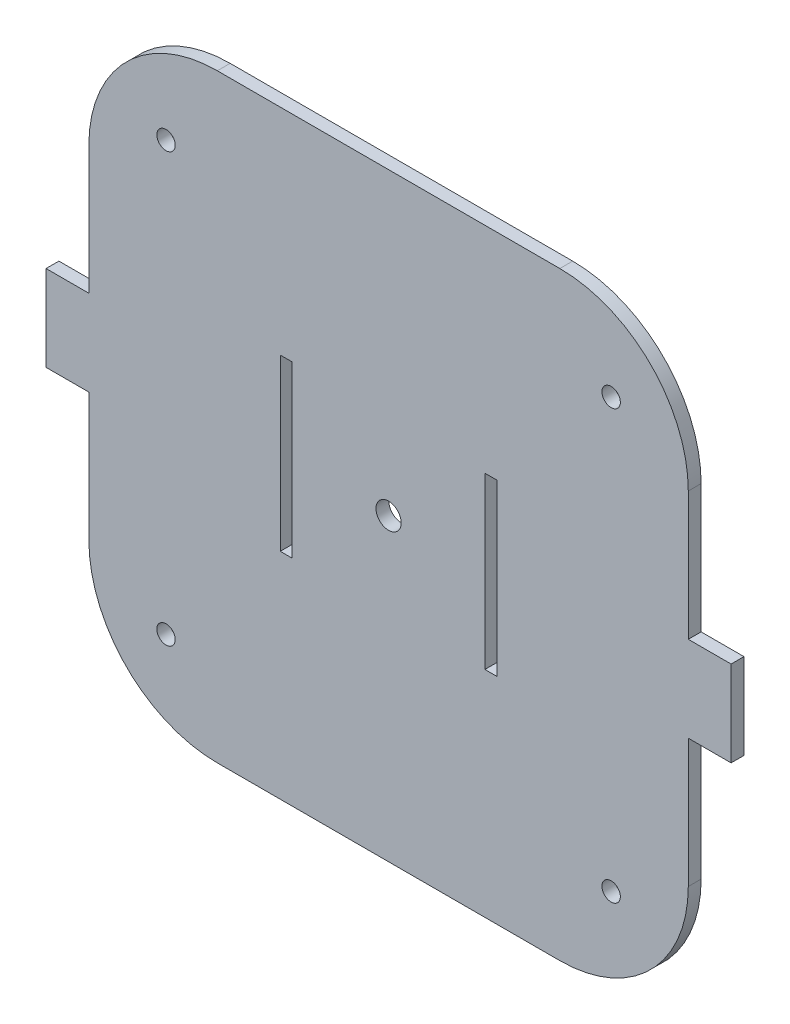
ISO-10303-21;
HEADER;
FILE_DESCRIPTION(('STEP AP214'),'2;1');
FILE_NAME('part.step','',(''),(''),'','','');
FILE_SCHEMA(('AUTOMOTIVE_DESIGN { 1 0 10303 214 1 1 1 1 }'));
ENDSEC;
DATA;
#1=APPLICATION_CONTEXT('core data for automotive mechanical design processes');
#2=APPLICATION_PROTOCOL_DEFINITION('international standard','automotive_design',2000,#1);
#3=PRODUCT_CONTEXT('',#1,'mechanical');
#4=PRODUCT('Part','Part','',(#3));
#5=PRODUCT_RELATED_PRODUCT_CATEGORY('part','',(#4));
#6=PRODUCT_DEFINITION_FORMATION('','',#4);
#7=PRODUCT_DEFINITION_CONTEXT('part definition',#1,'design');
#8=PRODUCT_DEFINITION('design','',#6,#7);
#9=PRODUCT_DEFINITION_SHAPE('','',#8);
#10=(LENGTH_UNIT() NAMED_UNIT(*) SI_UNIT(.MILLI.,.METRE.));
#11=(NAMED_UNIT(*) PLANE_ANGLE_UNIT() SI_UNIT($,.RADIAN.));
#12=(NAMED_UNIT(*) SI_UNIT($,.STERADIAN.) SOLID_ANGLE_UNIT());
#13=UNCERTAINTY_MEASURE_WITH_UNIT(LENGTH_MEASURE(1.E-05),#10,'distance_accuracy_value','');
#14=(GEOMETRIC_REPRESENTATION_CONTEXT(3) GLOBAL_UNCERTAINTY_ASSIGNED_CONTEXT((#13)) GLOBAL_UNIT_ASSIGNED_CONTEXT((#10,
#11,#12)) REPRESENTATION_CONTEXT('',''));
#15=CARTESIAN_POINT('',(0.,0.,0.));
#16=DIRECTION('',(0.,0.,1.));
#17=DIRECTION('',(1.,0.,0.));
#18=AXIS2_PLACEMENT_3D('',#15,#16,#17);
#19=CARTESIAN_POINT('',(30.,0.,3.));
#20=DIRECTION('',(0.,0.,1.));
#21=DIRECTION('',(1.,0.,0.));
#22=AXIS2_PLACEMENT_3D('',#19,#20,#21);
#23=PLANE('',#22);
#24=CARTESIAN_POINT('',(121.983290325234,-9.99999999999999,3.));
#25=DIRECTION('',(0.,0.,1.));
#26=DIRECTION('',(-1.,0.,0.));
#27=AXIS2_PLACEMENT_3D('',#24,#25,#26);
#28=CIRCLE('',#27,2.15);
#29=CARTESIAN_POINT('',(119.833290325234,-9.99999999999999,3.));
#30=VERTEX_POINT('',#29);
#31=EDGE_CURVE('E903',#30,#30,#28,.T.);
#32=ORIENTED_EDGE('',*,*,#31,.F.);
#33=EDGE_LOOP('',(#32));
#34=FACE_BOUND('',#33,.T.);
#35=CARTESIAN_POINT('',(18.0167096747658,-9.99999999999999,3.));
#36=DIRECTION('',(0.,0.,1.));
#37=DIRECTION('',(1.,0.,0.));
#38=AXIS2_PLACEMENT_3D('',#35,#36,#37);
#39=CIRCLE('',#38,2.15);
#40=CARTESIAN_POINT('',(20.1667096747658,-9.99999999999999,3.));
#41=VERTEX_POINT('',#40);
#42=EDGE_CURVE('E240',#41,#41,#39,.T.);
#43=ORIENTED_EDGE('',*,*,#42,.F.);
#44=EDGE_LOOP('',(#43));
#45=FACE_BOUND('',#44,.T.);
#46=CARTESIAN_POINT('',(30.,0.,3.));
#47=DIRECTION('',(0.,0.,1.));
#48=DIRECTION('',(1.,0.,0.));
#49=AXIS2_PLACEMENT_3D('',#46,#47,#48);
#50=CIRCLE('',#49,30.);
#51=CARTESIAN_POINT('',(0.,0.,3.));
#52=VERTEX_POINT('',#51);
#53=CARTESIAN_POINT('',(30.,-30.,3.));
#54=VERTEX_POINT('',#53);
#55=EDGE_CURVE('E308',#52,#54,#50,.T.);
#56=ORIENTED_EDGE('',*,*,#55,.T.);
#57=DIRECTION('',(1.,0.,0.));
#58=VECTOR('',#57,1.);
#59=CARTESIAN_POINT('',(30.,-30.,3.));
#60=LINE('',#59,#58);
#61=CARTESIAN_POINT('',(110.,-30.,3.));
#62=VERTEX_POINT('',#61);
#63=EDGE_CURVE('E312',#54,#62,#60,.T.);
#64=ORIENTED_EDGE('',*,*,#63,.T.);
#65=CARTESIAN_POINT('',(110.,0.,3.));
#66=DIRECTION('',(0.,0.,1.));
#67=DIRECTION('',(1.,0.,0.));
#68=AXIS2_PLACEMENT_3D('',#65,#66,#67);
#69=CIRCLE('',#68,30.);
#70=CARTESIAN_POINT('',(140.,0.,3.));
#71=VERTEX_POINT('',#70);
#72=EDGE_CURVE('E316',#62,#71,#69,.T.);
#73=ORIENTED_EDGE('',*,*,#72,.T.);
#74=DIRECTION('',(0.,1.,0.));
#75=VECTOR('',#74,1.);
#76=CARTESIAN_POINT('',(140.,30.,3.));
#77=LINE('',#76,#75);
#78=CARTESIAN_POINT('',(140.,30.,3.));
#79=VERTEX_POINT('',#78);
#80=EDGE_CURVE('E319',#71,#79,#77,.T.);
#81=ORIENTED_EDGE('',*,*,#80,.T.);
#82=DIRECTION('',(1.,0.,0.));
#83=VECTOR('',#82,1.);
#84=CARTESIAN_POINT('',(140.,30.,3.));
#85=LINE('',#84,#83);
#86=CARTESIAN_POINT('',(150.,30.,3.));
#87=VERTEX_POINT('',#86);
#88=EDGE_CURVE('E322',#79,#87,#85,.T.);
#89=ORIENTED_EDGE('',*,*,#88,.T.);
#90=DIRECTION('',(0.,1.,0.));
#91=VECTOR('',#90,1.);
#92=CARTESIAN_POINT('',(150.,40.,3.));
#93=LINE('',#92,#91);
#94=CARTESIAN_POINT('',(150.,50.,3.));
#95=VERTEX_POINT('',#94);
#96=EDGE_CURVE('E325',#87,#95,#93,.T.);
#97=ORIENTED_EDGE('',*,*,#96,.T.);
#98=DIRECTION('',(-1.,0.,0.));
#99=VECTOR('',#98,1.);
#100=CARTESIAN_POINT('',(140.,50.,3.));
#101=LINE('',#100,#99);
#102=CARTESIAN_POINT('',(140.,50.,3.));
#103=VERTEX_POINT('',#102);
#104=EDGE_CURVE('E328',#95,#103,#101,.T.);
#105=ORIENTED_EDGE('',*,*,#104,.T.);
#106=DIRECTION('',(0.,1.,0.));
#107=VECTOR('',#106,1.);
#108=CARTESIAN_POINT('',(140.,80.,3.));
#109=LINE('',#108,#107);
#110=CARTESIAN_POINT('',(140.,80.,3.));
#111=VERTEX_POINT('',#110);
#112=EDGE_CURVE('E331',#103,#111,#109,.T.);
#113=ORIENTED_EDGE('',*,*,#112,.T.);
#114=CARTESIAN_POINT('',(110.,80.,3.));
#115=DIRECTION('',(0.,0.,1.));
#116=DIRECTION('',(-1.,0.,0.));
#117=AXIS2_PLACEMENT_3D('',#114,#115,#116);
#118=CIRCLE('',#117,30.);
#119=CARTESIAN_POINT('',(110.,110.,3.));
#120=VERTEX_POINT('',#119);
#121=EDGE_CURVE('E334',#111,#120,#118,.T.);
#122=ORIENTED_EDGE('',*,*,#121,.T.);
#123=DIRECTION('',(-1.,0.,0.));
#124=VECTOR('',#123,1.);
#125=CARTESIAN_POINT('',(30.,110.,3.));
#126=LINE('',#125,#124);
#127=CARTESIAN_POINT('',(30.,110.,3.));
#128=VERTEX_POINT('',#127);
#129=EDGE_CURVE('E337',#120,#128,#126,.T.);
#130=ORIENTED_EDGE('',*,*,#129,.T.);
#131=CARTESIAN_POINT('',(30.,80.,3.));
#132=DIRECTION('',(0.,0.,1.));
#133=DIRECTION('',(-1.,0.,0.));
#134=AXIS2_PLACEMENT_3D('',#131,#132,#133);
#135=CIRCLE('',#134,30.);
#136=CARTESIAN_POINT('',(0.,80.,3.));
#137=VERTEX_POINT('',#136);
#138=EDGE_CURVE('E340',#128,#137,#135,.T.);
#139=ORIENTED_EDGE('',*,*,#138,.T.);
#140=DIRECTION('',(0.,-1.,0.));
#141=VECTOR('',#140,1.);
#142=CARTESIAN_POINT('',(0.,80.,3.));
#143=LINE('',#142,#141);
#144=CARTESIAN_POINT('',(0.,50.,3.));
#145=VERTEX_POINT('',#144);
#146=EDGE_CURVE('E343',#137,#145,#143,.T.);
#147=ORIENTED_EDGE('',*,*,#146,.T.);
#148=DIRECTION('',(-1.,0.,0.));
#149=VECTOR('',#148,1.);
#150=CARTESIAN_POINT('',(0.,50.,3.));
#151=LINE('',#150,#149);
#152=CARTESIAN_POINT('',(-10.,50.,3.));
#153=VERTEX_POINT('',#152);
#154=EDGE_CURVE('E346',#145,#153,#151,.T.);
#155=ORIENTED_EDGE('',*,*,#154,.T.);
#156=DIRECTION('',(0.,-1.,0.));
#157=VECTOR('',#156,1.);
#158=CARTESIAN_POINT('',(-10.,50.,3.));
#159=LINE('',#158,#157);
#160=CARTESIAN_POINT('',(-10.,30.,3.));
#161=VERTEX_POINT('',#160);
#162=EDGE_CURVE('E349',#153,#161,#159,.T.);
#163=ORIENTED_EDGE('',*,*,#162,.T.);
#164=DIRECTION('',(1.,0.,0.));
#165=VECTOR('',#164,1.);
#166=CARTESIAN_POINT('',(0.,30.,3.));
#167=LINE('',#166,#165);
#168=CARTESIAN_POINT('',(0.,30.,3.));
#169=VERTEX_POINT('',#168);
#170=EDGE_CURVE('E352',#161,#169,#167,.T.);
#171=ORIENTED_EDGE('',*,*,#170,.T.);
#172=DIRECTION('',(0.,-1.,0.));
#173=VECTOR('',#172,1.);
#174=CARTESIAN_POINT('',(0.,30.,3.));
#175=LINE('',#174,#173);
#176=EDGE_CURVE('E355',#169,#52,#175,.T.);
#177=ORIENTED_EDGE('',*,*,#176,.T.);
#178=EDGE_LOOP('',(#56,#64,#73,#81,#89,#97,#105,#113,#122,#130,#139,#147,#155,#163,#171,#177));
#179=FACE_BOUND('',#178,.T.);
#180=CARTESIAN_POINT('',(70.,40.,3.));
#181=DIRECTION('',(0.,0.,1.));
#182=DIRECTION('',(1.,0.,0.));
#183=AXIS2_PLACEMENT_3D('',#180,#181,#182);
#184=CIRCLE('',#183,2.95);
#185=CARTESIAN_POINT('',(72.95,40.,3.));
#186=VERTEX_POINT('',#185);
#187=EDGE_CURVE('E300',#186,#186,#184,.T.);
#188=ORIENTED_EDGE('',*,*,#187,.F.);
#189=EDGE_LOOP('',(#188));
#190=FACE_BOUND('',#189,.T.);
#191=DIRECTION('',(1.,0.,0.));
#192=VECTOR('',#191,1.);
#193=CARTESIAN_POINT('',(47.5,20.15,3.));
#194=LINE('',#193,#192);
#195=CARTESIAN_POINT('',(44.7,20.15,3.));
#196=VERTEX_POINT('',#195);
#197=CARTESIAN_POINT('',(47.5,20.15,3.));
#198=VERTEX_POINT('',#197);
#199=EDGE_CURVE('E259',#196,#198,#194,.T.);
#200=ORIENTED_EDGE('',*,*,#199,.F.);
#201=DIRECTION('',(0.,-1.,0.));
#202=VECTOR('',#201,1.);
#203=CARTESIAN_POINT('',(44.7,20.15,3.));
#204=LINE('',#203,#202);
#205=CARTESIAN_POINT('',(44.7,59.85,3.));
#206=VERTEX_POINT('',#205);
#207=EDGE_CURVE('E256',#206,#196,#204,.T.);
#208=ORIENTED_EDGE('',*,*,#207,.F.);
#209=DIRECTION('',(-1.,0.,0.));
#210=VECTOR('',#209,1.);
#211=CARTESIAN_POINT('',(44.7,59.85,3.));
#212=LINE('',#211,#210);
#213=CARTESIAN_POINT('',(47.5,59.85,3.));
#214=VERTEX_POINT('',#213);
#215=EDGE_CURVE('E267',#214,#206,#212,.T.);
#216=ORIENTED_EDGE('',*,*,#215,.F.);
#217=DIRECTION('',(0.,1.,0.));
#218=VECTOR('',#217,1.);
#219=CARTESIAN_POINT('',(47.5,40.,3.));
#220=LINE('',#219,#218);
#221=EDGE_CURVE('E263',#198,#214,#220,.T.);
#222=ORIENTED_EDGE('',*,*,#221,.F.);
#223=EDGE_LOOP('',(#200,#208,#216,#222));
#224=FACE_BOUND('',#223,.T.);
#225=DIRECTION('',(0.,-1.,0.));
#226=VECTOR('',#225,1.);
#227=CARTESIAN_POINT('',(92.5,59.85,3.));
#228=LINE('',#227,#226);
#229=CARTESIAN_POINT('',(92.5,59.85,3.));
#230=VERTEX_POINT('',#229);
#231=CARTESIAN_POINT('',(92.5,20.15,3.));
#232=VERTEX_POINT('',#231);
#233=EDGE_CURVE('E214',#230,#232,#228,.T.);
#234=ORIENTED_EDGE('',*,*,#233,.F.);
#235=DIRECTION('',(-1.,0.,0.));
#236=VECTOR('',#235,1.);
#237=CARTESIAN_POINT('',(95.3,59.85,3.));
#238=LINE('',#237,#236);
#239=CARTESIAN_POINT('',(95.3,59.85,3.));
#240=VERTEX_POINT('',#239);
#241=EDGE_CURVE('E205',#240,#230,#238,.T.);
#242=ORIENTED_EDGE('',*,*,#241,.F.);
#243=DIRECTION('',(0.,1.,0.));
#244=VECTOR('',#243,1.);
#245=CARTESIAN_POINT('',(95.3,20.15,3.));
#246=LINE('',#245,#244);
#247=CARTESIAN_POINT('',(95.3,20.15,3.));
#248=VERTEX_POINT('',#247);
#249=EDGE_CURVE('E232',#248,#240,#246,.T.);
#250=ORIENTED_EDGE('',*,*,#249,.F.);
#251=DIRECTION('',(1.,0.,0.));
#252=VECTOR('',#251,1.);
#253=CARTESIAN_POINT('',(92.5,20.15,3.));
#254=LINE('',#253,#252);
#255=EDGE_CURVE('E228',#232,#248,#254,.T.);
#256=ORIENTED_EDGE('',*,*,#255,.F.);
#257=EDGE_LOOP('',(#234,#242,#250,#256));
#258=FACE_BOUND('',#257,.T.);
#259=CARTESIAN_POINT('',(18.0167096747658,90.,3.));
#260=DIRECTION('',(0.,0.,1.));
#261=DIRECTION('',(-1.,0.,0.));
#262=AXIS2_PLACEMENT_3D('',#259,#260,#261);
#263=CIRCLE('',#262,2.15);
#264=CARTESIAN_POINT('',(15.8667096747658,90.,3.));
#265=VERTEX_POINT('',#264);
#266=EDGE_CURVE('E911',#265,#265,#263,.T.);
#267=ORIENTED_EDGE('',*,*,#266,.F.);
#268=EDGE_LOOP('',(#267));
#269=FACE_BOUND('',#268,.T.);
#270=CARTESIAN_POINT('',(121.983290325234,90.0000000000001,3.));
#271=DIRECTION('',(0.,0.,1.));
#272=DIRECTION('',(1.,0.,0.));
#273=AXIS2_PLACEMENT_3D('',#270,#271,#272);
#274=CIRCLE('',#273,2.15);
#275=CARTESIAN_POINT('',(124.133290325234,90.0000000000001,3.));
#276=VERTEX_POINT('',#275);
#277=EDGE_CURVE('E892',#276,#276,#274,.T.);
#278=ORIENTED_EDGE('',*,*,#277,.F.);
#279=EDGE_LOOP('',(#278));
#280=FACE_BOUND('',#279,.T.);
#281=ADVANCED_FACE('F43',(#34,#45,#179,#190,#224,#258,#269,#280),#23,.T.);
#282=CARTESIAN_POINT('',(30.,0.,0.));
#283=DIRECTION('',(0.,0.,1.));
#284=DIRECTION('',(1.,0.,0.));
#285=AXIS2_PLACEMENT_3D('',#282,#283,#284);
#286=PLANE('',#285);
#287=DIRECTION('',(0.,-1.,0.));
#288=VECTOR('',#287,1.);
#289=CARTESIAN_POINT('',(44.7,20.15,0.));
#290=LINE('',#289,#288);
#291=CARTESIAN_POINT('',(44.7,59.85,0.));
#292=VERTEX_POINT('',#291);
#293=CARTESIAN_POINT('',(44.7,20.15,0.));
#294=VERTEX_POINT('',#293);
#295=EDGE_CURVE('E223',#292,#294,#290,.T.);
#296=ORIENTED_EDGE('',*,*,#295,.T.);
#297=DIRECTION('',(1.,0.,0.));
#298=VECTOR('',#297,1.);
#299=CARTESIAN_POINT('',(47.5,20.15,0.));
#300=LINE('',#299,#298);
#301=CARTESIAN_POINT('',(47.5,20.15,0.));
#302=VERTEX_POINT('',#301);
#303=EDGE_CURVE('E274',#294,#302,#300,.T.);
#304=ORIENTED_EDGE('',*,*,#303,.T.);
#305=DIRECTION('',(0.,1.,0.));
#306=VECTOR('',#305,1.);
#307=CARTESIAN_POINT('',(47.5,59.85,0.));
#308=LINE('',#307,#306);
#309=CARTESIAN_POINT('',(47.5,59.85,0.));
#310=VERTEX_POINT('',#309);
#311=EDGE_CURVE('E278',#302,#310,#308,.T.);
#312=ORIENTED_EDGE('',*,*,#311,.T.);
#313=DIRECTION('',(-1.,0.,0.));
#314=VECTOR('',#313,1.);
#315=CARTESIAN_POINT('',(44.7,59.85,0.));
#316=LINE('',#315,#314);
#317=EDGE_CURVE('E260',#310,#292,#316,.T.);
#318=ORIENTED_EDGE('',*,*,#317,.T.);
#319=EDGE_LOOP('',(#296,#304,#312,#318));
#320=FACE_BOUND('',#319,.T.);
#321=CARTESIAN_POINT('',(30.,0.,0.));
#322=DIRECTION('',(0.,0.,1.));
#323=DIRECTION('',(1.,0.,0.));
#324=AXIS2_PLACEMENT_3D('',#321,#322,#323);
#325=CIRCLE('',#324,30.);
#326=CARTESIAN_POINT('',(0.,0.,0.));
#327=VERTEX_POINT('',#326);
#328=CARTESIAN_POINT('',(30.,-30.,0.));
#329=VERTEX_POINT('',#328);
#330=EDGE_CURVE('E304',#327,#329,#325,.T.);
#331=ORIENTED_EDGE('',*,*,#330,.F.);
#332=DIRECTION('',(0.,-1.,0.));
#333=VECTOR('',#332,1.);
#334=CARTESIAN_POINT('',(0.,30.,0.));
#335=LINE('',#334,#333);
#336=CARTESIAN_POINT('',(0.,30.,0.));
#337=VERTEX_POINT('',#336);
#338=EDGE_CURVE('E313',#337,#327,#335,.T.);
#339=ORIENTED_EDGE('',*,*,#338,.F.);
#340=DIRECTION('',(1.,0.,0.));
#341=VECTOR('',#340,1.);
#342=CARTESIAN_POINT('',(0.,30.,0.));
#343=LINE('',#342,#341);
#344=CARTESIAN_POINT('',(-10.,30.,0.));
#345=VERTEX_POINT('',#344);
#346=EDGE_CURVE('E403',#345,#337,#343,.T.);
#347=ORIENTED_EDGE('',*,*,#346,.F.);
#348=DIRECTION('',(0.,-1.,0.));
#349=VECTOR('',#348,1.);
#350=CARTESIAN_POINT('',(-10.,40.,0.));
#351=LINE('',#350,#349);
#352=CARTESIAN_POINT('',(-10.,50.,0.));
#353=VERTEX_POINT('',#352);
#354=EDGE_CURVE('E400',#353,#345,#351,.T.);
#355=ORIENTED_EDGE('',*,*,#354,.F.);
#356=DIRECTION('',(-1.,0.,0.));
#357=VECTOR('',#356,1.);
#358=CARTESIAN_POINT('',(0.,50.,0.));
#359=LINE('',#358,#357);
#360=CARTESIAN_POINT('',(0.,50.,0.));
#361=VERTEX_POINT('',#360);
#362=EDGE_CURVE('E396',#361,#353,#359,.T.);
#363=ORIENTED_EDGE('',*,*,#362,.F.);
#364=DIRECTION('',(0.,-1.,0.));
#365=VECTOR('',#364,1.);
#366=CARTESIAN_POINT('',(0.,80.,0.));
#367=LINE('',#366,#365);
#368=CARTESIAN_POINT('',(0.,80.,0.));
#369=VERTEX_POINT('',#368);
#370=EDGE_CURVE('E393',#369,#361,#367,.T.);
#371=ORIENTED_EDGE('',*,*,#370,.F.);
#372=CARTESIAN_POINT('',(30.,80.,0.));
#373=DIRECTION('',(0.,0.,1.));
#374=DIRECTION('',(-1.,0.,0.));
#375=AXIS2_PLACEMENT_3D('',#372,#373,#374);
#376=CIRCLE('',#375,30.);
#377=CARTESIAN_POINT('',(30.,110.,0.));
#378=VERTEX_POINT('',#377);
#379=EDGE_CURVE('E390',#378,#369,#376,.T.);
#380=ORIENTED_EDGE('',*,*,#379,.F.);
#381=DIRECTION('',(-1.,0.,0.));
#382=VECTOR('',#381,1.);
#383=CARTESIAN_POINT('',(30.,110.,0.));
#384=LINE('',#383,#382);
#385=CARTESIAN_POINT('',(110.,110.,0.));
#386=VERTEX_POINT('',#385);
#387=EDGE_CURVE('E387',#386,#378,#384,.T.);
#388=ORIENTED_EDGE('',*,*,#387,.F.);
#389=CARTESIAN_POINT('',(110.,80.,0.));
#390=DIRECTION('',(0.,0.,1.));
#391=DIRECTION('',(-1.,0.,0.));
#392=AXIS2_PLACEMENT_3D('',#389,#390,#391);
#393=CIRCLE('',#392,30.);
#394=CARTESIAN_POINT('',(140.,80.,0.));
#395=VERTEX_POINT('',#394);
#396=EDGE_CURVE('E384',#395,#386,#393,.T.);
#397=ORIENTED_EDGE('',*,*,#396,.F.);
#398=DIRECTION('',(0.,1.,0.));
#399=VECTOR('',#398,1.);
#400=CARTESIAN_POINT('',(140.,80.,0.));
#401=LINE('',#400,#399);
#402=CARTESIAN_POINT('',(140.,50.,0.));
#403=VERTEX_POINT('',#402);
#404=EDGE_CURVE('E381',#403,#395,#401,.T.);
#405=ORIENTED_EDGE('',*,*,#404,.F.);
#406=DIRECTION('',(-1.,0.,0.));
#407=VECTOR('',#406,1.);
#408=CARTESIAN_POINT('',(140.,50.,0.));
#409=LINE('',#408,#407);
#410=CARTESIAN_POINT('',(150.,50.,0.));
#411=VERTEX_POINT('',#410);
#412=EDGE_CURVE('E378',#411,#403,#409,.T.);
#413=ORIENTED_EDGE('',*,*,#412,.F.);
#414=DIRECTION('',(0.,1.,0.));
#415=VECTOR('',#414,1.);
#416=CARTESIAN_POINT('',(150.,50.,0.));
#417=LINE('',#416,#415);
#418=CARTESIAN_POINT('',(150.,30.,0.));
#419=VERTEX_POINT('',#418);
#420=EDGE_CURVE('E375',#419,#411,#417,.T.);
#421=ORIENTED_EDGE('',*,*,#420,.F.);
#422=DIRECTION('',(1.,0.,0.));
#423=VECTOR('',#422,1.);
#424=CARTESIAN_POINT('',(140.,30.,0.));
#425=LINE('',#424,#423);
#426=CARTESIAN_POINT('',(140.,30.,0.));
#427=VERTEX_POINT('',#426);
#428=EDGE_CURVE('E371',#427,#419,#425,.T.);
#429=ORIENTED_EDGE('',*,*,#428,.F.);
#430=DIRECTION('',(0.,1.,0.));
#431=VECTOR('',#430,1.);
#432=CARTESIAN_POINT('',(140.,30.,0.));
#433=LINE('',#432,#431);
#434=CARTESIAN_POINT('',(140.,0.,0.));
#435=VERTEX_POINT('',#434);
#436=EDGE_CURVE('E368',#435,#427,#433,.T.);
#437=ORIENTED_EDGE('',*,*,#436,.F.);
#438=CARTESIAN_POINT('',(110.,0.,0.));
#439=DIRECTION('',(0.,0.,1.));
#440=DIRECTION('',(1.,0.,0.));
#441=AXIS2_PLACEMENT_3D('',#438,#439,#440);
#442=CIRCLE('',#441,30.);
#443=CARTESIAN_POINT('',(110.,-30.,0.));
#444=VERTEX_POINT('',#443);
#445=EDGE_CURVE('E365',#444,#435,#442,.T.);
#446=ORIENTED_EDGE('',*,*,#445,.F.);
#447=DIRECTION('',(1.,0.,0.));
#448=VECTOR('',#447,1.);
#449=CARTESIAN_POINT('',(30.,-30.,0.));
#450=LINE('',#449,#448);
#451=EDGE_CURVE('E362',#329,#444,#450,.T.);
#452=ORIENTED_EDGE('',*,*,#451,.F.);
#453=EDGE_LOOP('',(#331,#339,#347,#355,#363,#371,#380,#388,#397,#405,#413,#421,#429,#437,#446,#452));
#454=FACE_BOUND('',#453,.T.);
#455=CARTESIAN_POINT('',(70.,40.,0.));
#456=DIRECTION('',(0.,0.,1.));
#457=DIRECTION('',(1.,0.,0.));
#458=AXIS2_PLACEMENT_3D('',#455,#456,#457);
#459=CIRCLE('',#458,2.95);
#460=CARTESIAN_POINT('',(72.95,40.,0.));
#461=VERTEX_POINT('',#460);
#462=EDGE_CURVE('E299',#461,#461,#459,.T.);
#463=ORIENTED_EDGE('',*,*,#462,.T.);
#464=EDGE_LOOP('',(#463));
#465=FACE_BOUND('',#464,.T.);
#466=DIRECTION('',(-1.,0.,0.));
#467=VECTOR('',#466,1.);
#468=CARTESIAN_POINT('',(95.3,59.85,0.));
#469=LINE('',#468,#467);
#470=CARTESIAN_POINT('',(95.3,59.85,0.));
#471=VERTEX_POINT('',#470);
#472=CARTESIAN_POINT('',(92.5,59.85,0.));
#473=VERTEX_POINT('',#472);
#474=EDGE_CURVE('E67',#471,#473,#469,.T.);
#475=ORIENTED_EDGE('',*,*,#474,.T.);
#476=DIRECTION('',(0.,-1.,0.));
#477=VECTOR('',#476,1.);
#478=CARTESIAN_POINT('',(92.5,40.,0.));
#479=LINE('',#478,#477);
#480=CARTESIAN_POINT('',(92.5,20.15,0.));
#481=VERTEX_POINT('',#480);
#482=EDGE_CURVE('E221',#473,#481,#479,.T.);
#483=ORIENTED_EDGE('',*,*,#482,.T.);
#484=DIRECTION('',(1.,0.,0.));
#485=VECTOR('',#484,1.);
#486=CARTESIAN_POINT('',(92.5,20.15,0.));
#487=LINE('',#486,#485);
#488=CARTESIAN_POINT('',(95.3,20.15,0.));
#489=VERTEX_POINT('',#488);
#490=EDGE_CURVE('E243',#481,#489,#487,.T.);
#491=ORIENTED_EDGE('',*,*,#490,.T.);
#492=DIRECTION('',(0.,1.,0.));
#493=VECTOR('',#492,1.);
#494=CARTESIAN_POINT('',(95.3,20.15,0.));
#495=LINE('',#494,#493);
#496=EDGE_CURVE('E215',#489,#471,#495,.T.);
#497=ORIENTED_EDGE('',*,*,#496,.T.);
#498=EDGE_LOOP('',(#475,#483,#491,#497));
#499=FACE_BOUND('',#498,.T.);
#500=CARTESIAN_POINT('',(18.0167096747658,-9.99999999999999,0.));
#501=DIRECTION('',(0.,0.,1.));
#502=DIRECTION('',(1.,0.,0.));
#503=AXIS2_PLACEMENT_3D('',#500,#501,#502);
#504=CIRCLE('',#503,2.15);
#505=CARTESIAN_POINT('',(20.1667096747658,-9.99999999999999,0.));
#506=VERTEX_POINT('',#505);
#507=EDGE_CURVE('E915',#506,#506,#504,.T.);
#508=ORIENTED_EDGE('',*,*,#507,.T.);
#509=EDGE_LOOP('',(#508));
#510=FACE_BOUND('',#509,.T.);
#511=CARTESIAN_POINT('',(18.0167096747658,90.,0.));
#512=DIRECTION('',(0.,0.,1.));
#513=DIRECTION('',(-1.,0.,0.));
#514=AXIS2_PLACEMENT_3D('',#511,#512,#513);
#515=CIRCLE('',#514,2.15);
#516=CARTESIAN_POINT('',(15.8667096747658,90.,0.));
#517=VERTEX_POINT('',#516);
#518=EDGE_CURVE('E907',#517,#517,#515,.T.);
#519=ORIENTED_EDGE('',*,*,#518,.T.);
#520=EDGE_LOOP('',(#519));
#521=FACE_BOUND('',#520,.T.);
#522=CARTESIAN_POINT('',(121.983290325234,-9.99999999999999,0.));
#523=DIRECTION('',(0.,0.,1.));
#524=DIRECTION('',(-1.,0.,0.));
#525=AXIS2_PLACEMENT_3D('',#522,#523,#524);
#526=CIRCLE('',#525,2.15);
#527=CARTESIAN_POINT('',(119.833290325234,-9.99999999999999,0.));
#528=VERTEX_POINT('',#527);
#529=EDGE_CURVE('E900',#528,#528,#526,.T.);
#530=ORIENTED_EDGE('',*,*,#529,.T.);
#531=EDGE_LOOP('',(#530));
#532=FACE_BOUND('',#531,.T.);
#533=CARTESIAN_POINT('',(121.983290325234,90.0000000000001,0.));
#534=DIRECTION('',(0.,0.,1.));
#535=DIRECTION('',(1.,0.,0.));
#536=AXIS2_PLACEMENT_3D('',#533,#534,#535);
#537=CIRCLE('',#536,2.15);
#538=CARTESIAN_POINT('',(124.133290325234,90.0000000000001,0.));
#539=VERTEX_POINT('',#538);
#540=EDGE_CURVE('E895',#539,#539,#537,.T.);
#541=ORIENTED_EDGE('',*,*,#540,.T.);
#542=EDGE_LOOP('',(#541));
#543=FACE_BOUND('',#542,.T.);
#544=ADVANCED_FACE('F474',(#320,#454,#465,#499,#510,#521,#532,#543),#286,.F.);
#545=CARTESIAN_POINT('',(30.,0.,3.));
#546=DIRECTION('',(0.,0.,-1.));
#547=DIRECTION('',(-1.,0.,0.));
#548=AXIS2_PLACEMENT_3D('',#545,#546,#547);
#549=CYLINDRICAL_SURFACE('',#548,30.);
#550=ORIENTED_EDGE('',*,*,#330,.T.);
#551=DIRECTION('',(0.,0.,-1.));
#552=VECTOR('',#551,1.);
#553=CARTESIAN_POINT('',(30.,-30.,3.));
#554=LINE('',#553,#552);
#555=EDGE_CURVE('E11',#54,#329,#554,.T.);
#556=ORIENTED_EDGE('',*,*,#555,.F.);
#557=ORIENTED_EDGE('',*,*,#55,.F.);
#558=DIRECTION('',(0.,0.,-1.));
#559=VECTOR('',#558,1.);
#560=CARTESIAN_POINT('',(0.,0.,3.));
#561=LINE('',#560,#559);
#562=EDGE_CURVE('E358',#52,#327,#561,.T.);
#563=ORIENTED_EDGE('',*,*,#562,.T.);
#564=EDGE_LOOP('',(#550,#556,#557,#563));
#565=FACE_BOUND('',#564,.T.);
#566=ADVANCED_FACE('F45',(#565),#549,.T.);
#567=CARTESIAN_POINT('',(30.,-30.,3.));
#568=DIRECTION('',(0.,1.,0.));
#569=DIRECTION('',(0.,0.,1.));
#570=AXIS2_PLACEMENT_3D('',#567,#568,#569);
#571=PLANE('',#570);
#572=ORIENTED_EDGE('',*,*,#451,.T.);
#573=DIRECTION('',(0.,0.,-1.));
#574=VECTOR('',#573,1.);
#575=CARTESIAN_POINT('',(110.,-30.,3.));
#576=LINE('',#575,#574);
#577=EDGE_CURVE('E52',#62,#444,#576,.T.);
#578=ORIENTED_EDGE('',*,*,#577,.F.);
#579=ORIENTED_EDGE('',*,*,#63,.F.);
#580=ORIENTED_EDGE('',*,*,#555,.T.);
#581=EDGE_LOOP('',(#572,#578,#579,#580));
#582=FACE_BOUND('',#581,.T.);
#583=ADVANCED_FACE('F491',(#582),#571,.F.);
#584=CARTESIAN_POINT('',(110.,0.,3.));
#585=DIRECTION('',(0.,0.,-1.));
#586=DIRECTION('',(-1.,0.,0.));
#587=AXIS2_PLACEMENT_3D('',#584,#585,#586);
#588=CYLINDRICAL_SURFACE('',#587,30.);
#589=ORIENTED_EDGE('',*,*,#445,.T.);
#590=DIRECTION('',(0.,0.,-1.));
#591=VECTOR('',#590,1.);
#592=CARTESIAN_POINT('',(140.,0.,3.));
#593=LINE('',#592,#591);
#594=EDGE_CURVE('E459',#71,#435,#593,.T.);
#595=ORIENTED_EDGE('',*,*,#594,.F.);
#596=ORIENTED_EDGE('',*,*,#72,.F.);
#597=ORIENTED_EDGE('',*,*,#577,.T.);
#598=EDGE_LOOP('',(#589,#595,#596,#597));
#599=FACE_BOUND('',#598,.T.);
#600=ADVANCED_FACE('F468',(#599),#588,.T.);
#601=CARTESIAN_POINT('',(140.,30.,3.));
#602=DIRECTION('',(-1.,0.,0.));
#603=DIRECTION('',(0.,-1.,0.));
#604=AXIS2_PLACEMENT_3D('',#601,#602,#603);
#605=PLANE('',#604);
#606=ORIENTED_EDGE('',*,*,#436,.T.);
#607=DIRECTION('',(0.,0.,-1.));
#608=VECTOR('',#607,1.);
#609=CARTESIAN_POINT('',(140.,30.,3.));
#610=LINE('',#609,#608);
#611=EDGE_CURVE('E455',#79,#427,#610,.T.);
#612=ORIENTED_EDGE('',*,*,#611,.F.);
#613=ORIENTED_EDGE('',*,*,#80,.F.);
#614=ORIENTED_EDGE('',*,*,#594,.T.);
#615=EDGE_LOOP('',(#606,#612,#613,#614));
#616=FACE_BOUND('',#615,.T.);
#617=ADVANCED_FACE('F479',(#616),#605,.F.);
#618=CARTESIAN_POINT('',(140.,30.,3.));
#619=DIRECTION('',(0.,1.,0.));
#620=DIRECTION('',(0.,0.,1.));
#621=AXIS2_PLACEMENT_3D('',#618,#619,#620);
#622=PLANE('',#621);
#623=ORIENTED_EDGE('',*,*,#428,.T.);
#624=DIRECTION('',(0.,0.,-1.));
#625=VECTOR('',#624,1.);
#626=CARTESIAN_POINT('',(150.,30.,3.));
#627=LINE('',#626,#625);
#628=EDGE_CURVE('E451',#87,#419,#627,.T.);
#629=ORIENTED_EDGE('',*,*,#628,.F.);
#630=ORIENTED_EDGE('',*,*,#88,.F.);
#631=ORIENTED_EDGE('',*,*,#611,.T.);
#632=EDGE_LOOP('',(#623,#629,#630,#631));
#633=FACE_BOUND('',#632,.T.);
#634=ADVANCED_FACE('F483',(#633),#622,.F.);
#635=CARTESIAN_POINT('',(150.,50.,3.));
#636=DIRECTION('',(-1.,0.,0.));
#637=DIRECTION('',(0.,0.,1.));
#638=AXIS2_PLACEMENT_3D('',#635,#636,#637);
#639=PLANE('',#638);
#640=ORIENTED_EDGE('',*,*,#420,.T.);
#641=DIRECTION('',(0.,0.,-1.));
#642=VECTOR('',#641,1.);
#643=CARTESIAN_POINT('',(150.,50.,3.));
#644=LINE('',#643,#642);
#645=EDGE_CURVE('E447',#95,#411,#644,.T.);
#646=ORIENTED_EDGE('',*,*,#645,.F.);
#647=ORIENTED_EDGE('',*,*,#96,.F.);
#648=ORIENTED_EDGE('',*,*,#628,.T.);
#649=EDGE_LOOP('',(#640,#646,#647,#648));
#650=FACE_BOUND('',#649,.T.);
#651=ADVANCED_FACE('F543',(#650),#639,.F.);
#652=CARTESIAN_POINT('',(140.,50.,3.));
#653=DIRECTION('',(0.,-1.,0.));
#654=DIRECTION('',(0.,0.,-1.));
#655=AXIS2_PLACEMENT_3D('',#652,#653,#654);
#656=PLANE('',#655);
#657=ORIENTED_EDGE('',*,*,#412,.T.);
#658=DIRECTION('',(0.,0.,-1.));
#659=VECTOR('',#658,1.);
#660=CARTESIAN_POINT('',(140.,50.,3.));
#661=LINE('',#660,#659);
#662=EDGE_CURVE('E443',#103,#403,#661,.T.);
#663=ORIENTED_EDGE('',*,*,#662,.F.);
#664=ORIENTED_EDGE('',*,*,#104,.F.);
#665=ORIENTED_EDGE('',*,*,#645,.T.);
#666=EDGE_LOOP('',(#657,#663,#664,#665));
#667=FACE_BOUND('',#666,.T.);
#668=ADVANCED_FACE('F541',(#667),#656,.F.);
#669=CARTESIAN_POINT('',(140.,80.,3.));
#670=DIRECTION('',(-1.,0.,0.));
#671=DIRECTION('',(0.,-1.,0.));
#672=AXIS2_PLACEMENT_3D('',#669,#670,#671);
#673=PLANE('',#672);
#674=ORIENTED_EDGE('',*,*,#404,.T.);
#675=DIRECTION('',(0.,0.,-1.));
#676=VECTOR('',#675,1.);
#677=CARTESIAN_POINT('',(140.,80.,3.));
#678=LINE('',#677,#676);
#679=EDGE_CURVE('E439',#111,#395,#678,.T.);
#680=ORIENTED_EDGE('',*,*,#679,.F.);
#681=ORIENTED_EDGE('',*,*,#112,.F.);
#682=ORIENTED_EDGE('',*,*,#662,.T.);
#683=EDGE_LOOP('',(#674,#680,#681,#682));
#684=FACE_BOUND('',#683,.T.);
#685=ADVANCED_FACE('F536',(#684),#673,.F.);
#686=CARTESIAN_POINT('',(110.,80.,3.));
#687=DIRECTION('',(0.,0.,-1.));
#688=DIRECTION('',(-1.,0.,0.));
#689=AXIS2_PLACEMENT_3D('',#686,#687,#688);
#690=CYLINDRICAL_SURFACE('',#689,30.);
#691=ORIENTED_EDGE('',*,*,#396,.T.);
#692=DIRECTION('',(0.,0.,-1.));
#693=VECTOR('',#692,1.);
#694=CARTESIAN_POINT('',(110.,110.,3.));
#695=LINE('',#694,#693);
#696=EDGE_CURVE('E435',#120,#386,#695,.T.);
#697=ORIENTED_EDGE('',*,*,#696,.F.);
#698=ORIENTED_EDGE('',*,*,#121,.F.);
#699=ORIENTED_EDGE('',*,*,#679,.T.);
#700=EDGE_LOOP('',(#691,#697,#698,#699));
#701=FACE_BOUND('',#700,.T.);
#702=ADVANCED_FACE('F531',(#701),#690,.T.);
#703=CARTESIAN_POINT('',(30.,110.,3.));
#704=DIRECTION('',(0.,-1.,0.));
#705=DIRECTION('',(0.,0.,-1.));
#706=AXIS2_PLACEMENT_3D('',#703,#704,#705);
#707=PLANE('',#706);
#708=ORIENTED_EDGE('',*,*,#387,.T.);
#709=DIRECTION('',(0.,0.,-1.));
#710=VECTOR('',#709,1.);
#711=CARTESIAN_POINT('',(30.,110.,3.));
#712=LINE('',#711,#710);
#713=EDGE_CURVE('E431',#128,#378,#712,.T.);
#714=ORIENTED_EDGE('',*,*,#713,.F.);
#715=ORIENTED_EDGE('',*,*,#129,.F.);
#716=ORIENTED_EDGE('',*,*,#696,.T.);
#717=EDGE_LOOP('',(#708,#714,#715,#716));
#718=FACE_BOUND('',#717,.T.);
#719=ADVANCED_FACE('F527',(#718),#707,.F.);
#720=CARTESIAN_POINT('',(30.,80.,3.));
#721=DIRECTION('',(0.,0.,-1.));
#722=DIRECTION('',(-1.,0.,0.));
#723=AXIS2_PLACEMENT_3D('',#720,#721,#722);
#724=CYLINDRICAL_SURFACE('',#723,30.);
#725=ORIENTED_EDGE('',*,*,#379,.T.);
#726=DIRECTION('',(0.,0.,-1.));
#727=VECTOR('',#726,1.);
#728=CARTESIAN_POINT('',(0.,80.,3.));
#729=LINE('',#728,#727);
#730=EDGE_CURVE('E427',#137,#369,#729,.T.);
#731=ORIENTED_EDGE('',*,*,#730,.F.);
#732=ORIENTED_EDGE('',*,*,#138,.F.);
#733=ORIENTED_EDGE('',*,*,#713,.T.);
#734=EDGE_LOOP('',(#725,#731,#732,#733));
#735=FACE_BOUND('',#734,.T.);
#736=ADVANCED_FACE('F522',(#735),#724,.T.);
#737=CARTESIAN_POINT('',(0.,80.,3.));
#738=DIRECTION('',(1.,0.,0.));
#739=DIRECTION('',(0.,1.,0.));
#740=AXIS2_PLACEMENT_3D('',#737,#738,#739);
#741=PLANE('',#740);
#742=ORIENTED_EDGE('',*,*,#370,.T.);
#743=DIRECTION('',(0.,0.,-1.));
#744=VECTOR('',#743,1.);
#745=CARTESIAN_POINT('',(0.,50.,3.));
#746=LINE('',#745,#744);
#747=EDGE_CURVE('E423',#145,#361,#746,.T.);
#748=ORIENTED_EDGE('',*,*,#747,.F.);
#749=ORIENTED_EDGE('',*,*,#146,.F.);
#750=ORIENTED_EDGE('',*,*,#730,.T.);
#751=EDGE_LOOP('',(#742,#748,#749,#750));
#752=FACE_BOUND('',#751,.T.);
#753=ADVANCED_FACE('F516',(#752),#741,.F.);
#754=CARTESIAN_POINT('',(0.,50.,3.));
#755=DIRECTION('',(0.,-1.,0.));
#756=DIRECTION('',(1.,0.,0.));
#757=AXIS2_PLACEMENT_3D('',#754,#755,#756);
#758=PLANE('',#757);
#759=ORIENTED_EDGE('',*,*,#362,.T.);
#760=DIRECTION('',(0.,0.,-1.));
#761=VECTOR('',#760,1.);
#762=CARTESIAN_POINT('',(-10.,50.,3.));
#763=LINE('',#762,#761);
#764=EDGE_CURVE('E419',#153,#353,#763,.T.);
#765=ORIENTED_EDGE('',*,*,#764,.F.);
#766=ORIENTED_EDGE('',*,*,#154,.F.);
#767=ORIENTED_EDGE('',*,*,#747,.T.);
#768=EDGE_LOOP('',(#759,#765,#766,#767));
#769=FACE_BOUND('',#768,.T.);
#770=ADVANCED_FACE('F511',(#769),#758,.F.);
#771=CARTESIAN_POINT('',(-10.,40.,3.));
#772=DIRECTION('',(1.,0.,0.));
#773=DIRECTION('',(0.,1.,0.));
#774=AXIS2_PLACEMENT_3D('',#771,#772,#773);
#775=PLANE('',#774);
#776=ORIENTED_EDGE('',*,*,#354,.T.);
#777=DIRECTION('',(0.,0.,-1.));
#778=VECTOR('',#777,1.);
#779=CARTESIAN_POINT('',(-10.,30.,3.));
#780=LINE('',#779,#778);
#781=EDGE_CURVE('E415',#161,#345,#780,.T.);
#782=ORIENTED_EDGE('',*,*,#781,.F.);
#783=ORIENTED_EDGE('',*,*,#162,.F.);
#784=ORIENTED_EDGE('',*,*,#764,.T.);
#785=EDGE_LOOP('',(#776,#782,#783,#784));
#786=FACE_BOUND('',#785,.T.);
#787=ADVANCED_FACE('F506',(#786),#775,.F.);
#788=CARTESIAN_POINT('',(0.,30.,3.));
#789=DIRECTION('',(0.,1.,0.));
#790=DIRECTION('',(0.,0.,1.));
#791=AXIS2_PLACEMENT_3D('',#788,#789,#790);
#792=PLANE('',#791);
#793=ORIENTED_EDGE('',*,*,#346,.T.);
#794=DIRECTION('',(0.,0.,-1.));
#795=VECTOR('',#794,1.);
#796=CARTESIAN_POINT('',(0.,30.,3.));
#797=LINE('',#796,#795);
#798=EDGE_CURVE('E411',#169,#337,#797,.T.);
#799=ORIENTED_EDGE('',*,*,#798,.F.);
#800=ORIENTED_EDGE('',*,*,#170,.F.);
#801=ORIENTED_EDGE('',*,*,#781,.T.);
#802=EDGE_LOOP('',(#793,#799,#800,#801));
#803=FACE_BOUND('',#802,.T.);
#804=ADVANCED_FACE('F502',(#803),#792,.F.);
#805=CARTESIAN_POINT('',(0.,30.,3.));
#806=DIRECTION('',(1.,0.,0.));
#807=DIRECTION('',(0.,1.,0.));
#808=AXIS2_PLACEMENT_3D('',#805,#806,#807);
#809=PLANE('',#808);
#810=ORIENTED_EDGE('',*,*,#338,.T.);
#811=ORIENTED_EDGE('',*,*,#562,.F.);
#812=ORIENTED_EDGE('',*,*,#176,.F.);
#813=ORIENTED_EDGE('',*,*,#798,.T.);
#814=EDGE_LOOP('',(#810,#811,#812,#813));
#815=FACE_BOUND('',#814,.T.);
#816=ADVANCED_FACE('F497',(#815),#809,.F.);
#817=CARTESIAN_POINT('',(70.,40.,3.));
#818=DIRECTION('',(0.,0.,-1.));
#819=DIRECTION('',(-1.,0.,0.));
#820=AXIS2_PLACEMENT_3D('',#817,#818,#819);
#821=CYLINDRICAL_SURFACE('',#820,2.95);
#822=ORIENTED_EDGE('',*,*,#187,.T.);
#823=EDGE_LOOP('',(#822));
#824=FACE_BOUND('',#823,.T.);
#825=ORIENTED_EDGE('',*,*,#462,.F.);
#826=EDGE_LOOP('',(#825));
#827=FACE_BOUND('',#826,.T.);
#828=ADVANCED_FACE('F563',(#824,#827),#821,.F.);
#829=CARTESIAN_POINT('',(44.7,20.15,3.));
#830=DIRECTION('',(1.,0.,0.));
#831=DIRECTION('',(0.,1.,0.));
#832=AXIS2_PLACEMENT_3D('',#829,#830,#831);
#833=PLANE('',#832);
#834=ORIENTED_EDGE('',*,*,#295,.F.);
#835=DIRECTION('',(0.,0.,-1.));
#836=VECTOR('',#835,1.);
#837=CARTESIAN_POINT('',(44.7,59.85,3.));
#838=LINE('',#837,#836);
#839=EDGE_CURVE('E270',#206,#292,#838,.T.);
#840=ORIENTED_EDGE('',*,*,#839,.F.);
#841=ORIENTED_EDGE('',*,*,#207,.T.);
#842=DIRECTION('',(0.,0.,-1.));
#843=VECTOR('',#842,1.);
#844=CARTESIAN_POINT('',(44.7,20.15,3.));
#845=LINE('',#844,#843);
#846=EDGE_CURVE('E295',#196,#294,#845,.T.);
#847=ORIENTED_EDGE('',*,*,#846,.T.);
#848=EDGE_LOOP('',(#834,#840,#841,#847));
#849=FACE_BOUND('',#848,.T.);
#850=ADVANCED_FACE('F625',(#849),#833,.T.);
#851=CARTESIAN_POINT('',(47.5,20.15,3.));
#852=DIRECTION('',(0.,1.,0.));
#853=DIRECTION('',(0.,0.,1.));
#854=AXIS2_PLACEMENT_3D('',#851,#852,#853);
#855=PLANE('',#854);
#856=ORIENTED_EDGE('',*,*,#303,.F.);
#857=ORIENTED_EDGE('',*,*,#846,.F.);
#858=ORIENTED_EDGE('',*,*,#199,.T.);
#859=DIRECTION('',(0.,0.,-1.));
#860=VECTOR('',#859,1.);
#861=CARTESIAN_POINT('',(47.5,20.15,3.));
#862=LINE('',#861,#860);
#863=EDGE_CURVE('E291',#198,#302,#862,.T.);
#864=ORIENTED_EDGE('',*,*,#863,.T.);
#865=EDGE_LOOP('',(#856,#857,#858,#864));
#866=FACE_BOUND('',#865,.T.);
#867=ADVANCED_FACE('F632',(#866),#855,.T.);
#868=CARTESIAN_POINT('',(47.5,59.85,3.));
#869=DIRECTION('',(-1.,0.,0.));
#870=DIRECTION('',(0.,-1.,0.));
#871=AXIS2_PLACEMENT_3D('',#868,#869,#870);
#872=PLANE('',#871);
#873=ORIENTED_EDGE('',*,*,#311,.F.);
#874=ORIENTED_EDGE('',*,*,#863,.F.);
#875=ORIENTED_EDGE('',*,*,#221,.T.);
#876=DIRECTION('',(0.,0.,-1.));
#877=VECTOR('',#876,1.);
#878=CARTESIAN_POINT('',(47.5,59.85,3.));
#879=LINE('',#878,#877);
#880=EDGE_CURVE('E288',#214,#310,#879,.T.);
#881=ORIENTED_EDGE('',*,*,#880,.T.);
#882=EDGE_LOOP('',(#873,#874,#875,#881));
#883=FACE_BOUND('',#882,.T.);
#884=ADVANCED_FACE('F639',(#883),#872,.T.);
#885=CARTESIAN_POINT('',(44.7,59.85,3.));
#886=DIRECTION('',(0.,-1.,0.));
#887=DIRECTION('',(0.,0.,-1.));
#888=AXIS2_PLACEMENT_3D('',#885,#886,#887);
#889=PLANE('',#888);
#890=ORIENTED_EDGE('',*,*,#317,.F.);
#891=ORIENTED_EDGE('',*,*,#880,.F.);
#892=ORIENTED_EDGE('',*,*,#215,.T.);
#893=ORIENTED_EDGE('',*,*,#839,.T.);
#894=EDGE_LOOP('',(#890,#891,#892,#893));
#895=FACE_BOUND('',#894,.T.);
#896=ADVANCED_FACE('F647',(#895),#889,.T.);
#897=CARTESIAN_POINT('',(95.3,59.85,3.));
#898=DIRECTION('',(0.,-1.,0.));
#899=DIRECTION('',(0.,0.,-1.));
#900=AXIS2_PLACEMENT_3D('',#897,#898,#899);
#901=PLANE('',#900);
#902=ORIENTED_EDGE('',*,*,#474,.F.);
#903=DIRECTION('',(0.,0.,-1.));
#904=VECTOR('',#903,1.);
#905=CARTESIAN_POINT('',(95.3,59.85,3.));
#906=LINE('',#905,#904);
#907=EDGE_CURVE('E209',#240,#471,#906,.T.);
#908=ORIENTED_EDGE('',*,*,#907,.F.);
#909=ORIENTED_EDGE('',*,*,#241,.T.);
#910=DIRECTION('',(0.,0.,-1.));
#911=VECTOR('',#910,1.);
#912=CARTESIAN_POINT('',(92.5,59.85,3.));
#913=LINE('',#912,#911);
#914=EDGE_CURVE('E208',#230,#473,#913,.T.);
#915=ORIENTED_EDGE('',*,*,#914,.T.);
#916=EDGE_LOOP('',(#902,#908,#909,#915));
#917=FACE_BOUND('',#916,.T.);
#918=ADVANCED_FACE('F207',(#917),#901,.T.);
#919=CARTESIAN_POINT('',(92.5,40.,3.));
#920=DIRECTION('',(1.,0.,0.));
#921=DIRECTION('',(0.,1.,0.));
#922=AXIS2_PLACEMENT_3D('',#919,#920,#921);
#923=PLANE('',#922);
#924=ORIENTED_EDGE('',*,*,#482,.F.);
#925=ORIENTED_EDGE('',*,*,#914,.F.);
#926=ORIENTED_EDGE('',*,*,#233,.T.);
#927=DIRECTION('',(0.,0.,-1.));
#928=VECTOR('',#927,1.);
#929=CARTESIAN_POINT('',(92.5,20.15,3.));
#930=LINE('',#929,#928);
#931=EDGE_CURVE('E224',#232,#481,#930,.T.);
#932=ORIENTED_EDGE('',*,*,#931,.T.);
#933=EDGE_LOOP('',(#924,#925,#926,#932));
#934=FACE_BOUND('',#933,.T.);
#935=ADVANCED_FACE('F218',(#934),#923,.T.);
#936=CARTESIAN_POINT('',(92.5,20.15,3.));
#937=DIRECTION('',(0.,1.,0.));
#938=DIRECTION('',(0.,0.,1.));
#939=AXIS2_PLACEMENT_3D('',#936,#937,#938);
#940=PLANE('',#939);
#941=ORIENTED_EDGE('',*,*,#490,.F.);
#942=ORIENTED_EDGE('',*,*,#931,.F.);
#943=ORIENTED_EDGE('',*,*,#255,.T.);
#944=DIRECTION('',(0.,0.,-1.));
#945=VECTOR('',#944,1.);
#946=CARTESIAN_POINT('',(95.3,20.15,3.));
#947=LINE('',#946,#945);
#948=EDGE_CURVE('E59',#248,#489,#947,.T.);
#949=ORIENTED_EDGE('',*,*,#948,.T.);
#950=EDGE_LOOP('',(#941,#942,#943,#949));
#951=FACE_BOUND('',#950,.T.);
#952=ADVANCED_FACE('F668',(#951),#940,.T.);
#953=CARTESIAN_POINT('',(95.3,20.15,3.));
#954=DIRECTION('',(-1.,0.,0.));
#955=DIRECTION('',(0.,-1.,0.));
#956=AXIS2_PLACEMENT_3D('',#953,#954,#955);
#957=PLANE('',#956);
#958=ORIENTED_EDGE('',*,*,#496,.F.);
#959=ORIENTED_EDGE('',*,*,#948,.F.);
#960=ORIENTED_EDGE('',*,*,#249,.T.);
#961=ORIENTED_EDGE('',*,*,#907,.T.);
#962=EDGE_LOOP('',(#958,#959,#960,#961));
#963=FACE_BOUND('',#962,.T.);
#964=ADVANCED_FACE('F675',(#963),#957,.T.);
#965=CARTESIAN_POINT('',(18.0167096747658,-9.99999999999999,3.));
#966=DIRECTION('',(0.,0.,-1.));
#967=DIRECTION('',(-1.,0.,0.));
#968=AXIS2_PLACEMENT_3D('',#965,#966,#967);
#969=CYLINDRICAL_SURFACE('',#968,2.15);
#970=ORIENTED_EDGE('',*,*,#42,.T.);
#971=EDGE_LOOP('',(#970));
#972=FACE_BOUND('',#971,.T.);
#973=ORIENTED_EDGE('',*,*,#507,.F.);
#974=EDGE_LOOP('',(#973));
#975=FACE_BOUND('',#974,.T.);
#976=ADVANCED_FACE('F683',(#972,#975),#969,.F.);
#977=CARTESIAN_POINT('',(18.0167096747658,90.,3.));
#978=DIRECTION('',(0.,0.,-1.));
#979=DIRECTION('',(-1.,0.,0.));
#980=AXIS2_PLACEMENT_3D('',#977,#978,#979);
#981=CYLINDRICAL_SURFACE('',#980,2.15);
#982=ORIENTED_EDGE('',*,*,#266,.T.);
#983=EDGE_LOOP('',(#982));
#984=FACE_BOUND('',#983,.T.);
#985=ORIENTED_EDGE('',*,*,#518,.F.);
#986=EDGE_LOOP('',(#985));
#987=FACE_BOUND('',#986,.T.);
#988=ADVANCED_FACE('F690',(#984,#987),#981,.F.);
#989=CARTESIAN_POINT('',(121.983290325234,-9.99999999999999,3.));
#990=DIRECTION('',(0.,0.,-1.));
#991=DIRECTION('',(-1.,0.,0.));
#992=AXIS2_PLACEMENT_3D('',#989,#990,#991);
#993=CYLINDRICAL_SURFACE('',#992,2.15);
#994=ORIENTED_EDGE('',*,*,#31,.T.);
#995=EDGE_LOOP('',(#994));
#996=FACE_BOUND('',#995,.T.);
#997=ORIENTED_EDGE('',*,*,#529,.F.);
#998=EDGE_LOOP('',(#997));
#999=FACE_BOUND('',#998,.T.);
#1000=ADVANCED_FACE('F698',(#996,#999),#993,.F.);
#1001=CARTESIAN_POINT('',(121.983290325234,90.0000000000001,3.));
#1002=DIRECTION('',(0.,0.,-1.));
#1003=DIRECTION('',(-1.,0.,0.));
#1004=AXIS2_PLACEMENT_3D('',#1001,#1002,#1003);
#1005=CYLINDRICAL_SURFACE('',#1004,2.15);
#1006=ORIENTED_EDGE('',*,*,#277,.T.);
#1007=EDGE_LOOP('',(#1006));
#1008=FACE_BOUND('',#1007,.T.);
#1009=ORIENTED_EDGE('',*,*,#540,.F.);
#1010=EDGE_LOOP('',(#1009));
#1011=FACE_BOUND('',#1010,.T.);
#1012=ADVANCED_FACE('F706',(#1008,#1011),#1005,.F.);
#1013=CLOSED_SHELL('',(#281,#544,#566,#583,#600,#617,#634,#651,#668,#685,#702,#719,#736,#753,
#770,#787,#804,#816,#828,#850,#867,#884,#896,#918,#935,#952,#964,#976,#988,#1000,#1012));
#1014=MANIFOLD_SOLID_BREP('B2',#1013);
#1015=ADVANCED_BREP_SHAPE_REPRESENTATION('',(#18,#1014),#14);
#1016=SHAPE_DEFINITION_REPRESENTATION(#9,#1015);
ENDSEC;
END-ISO-10303-21;
